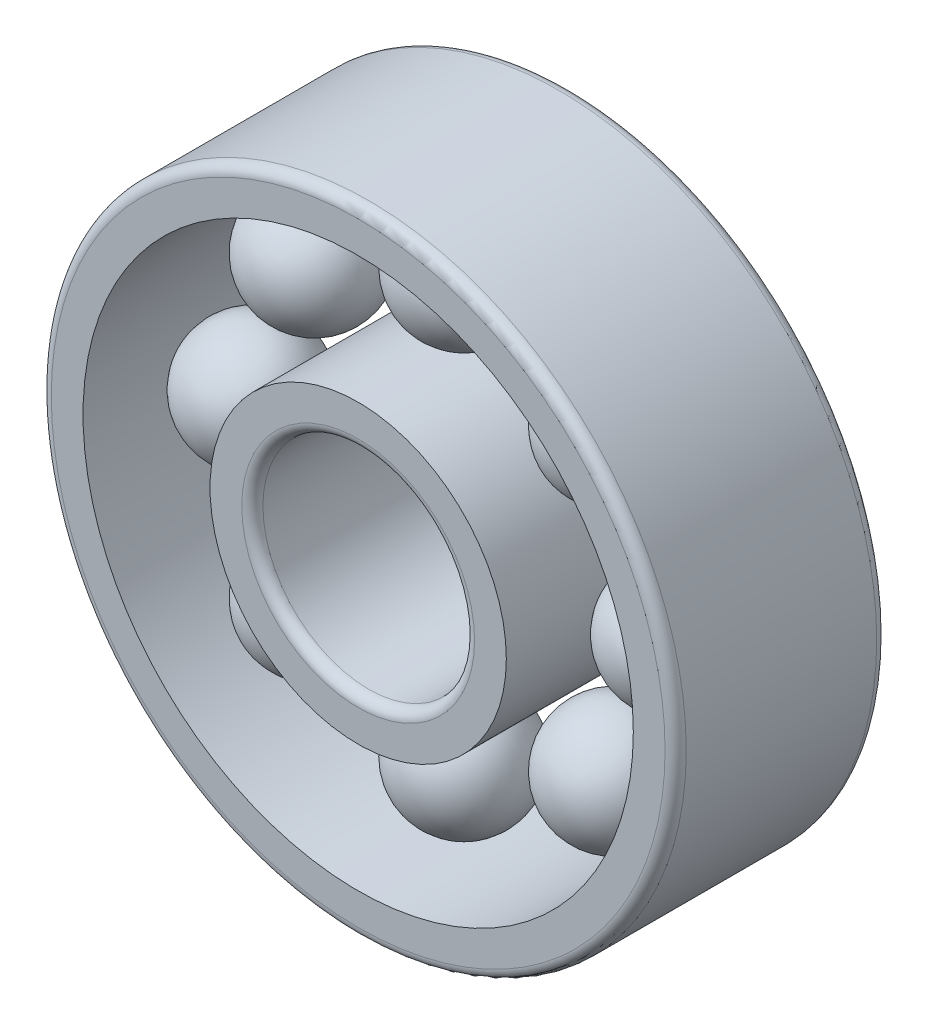
ISO-10303-21;
HEADER;
FILE_DESCRIPTION(('STEP AP214'),'2;1');
FILE_NAME('part.step','',(''),(''),'','','');
FILE_SCHEMA(('AUTOMOTIVE_DESIGN { 1 0 10303 214 1 1 1 1 }'));
ENDSEC;
DATA;
#1=APPLICATION_CONTEXT('core data for automotive mechanical design processes');
#2=APPLICATION_PROTOCOL_DEFINITION('international standard','automotive_design',2000,#1);
#3=PRODUCT_CONTEXT('',#1,'mechanical');
#4=PRODUCT('Part','Part','',(#3));
#5=PRODUCT_RELATED_PRODUCT_CATEGORY('part','',(#4));
#6=PRODUCT_DEFINITION_FORMATION('','',#4);
#7=PRODUCT_DEFINITION_CONTEXT('part definition',#1,'design');
#8=PRODUCT_DEFINITION('design','',#6,#7);
#9=PRODUCT_DEFINITION_SHAPE('','',#8);
#10=(LENGTH_UNIT() NAMED_UNIT(*) SI_UNIT(.MILLI.,.METRE.));
#11=(NAMED_UNIT(*) PLANE_ANGLE_UNIT() SI_UNIT($,.RADIAN.));
#12=(NAMED_UNIT(*) SI_UNIT($,.STERADIAN.) SOLID_ANGLE_UNIT());
#13=UNCERTAINTY_MEASURE_WITH_UNIT(LENGTH_MEASURE(1.E-05),#10,'distance_accuracy_value','');
#14=(GEOMETRIC_REPRESENTATION_CONTEXT(3) GLOBAL_UNCERTAINTY_ASSIGNED_CONTEXT((#13)) GLOBAL_UNIT_ASSIGNED_CONTEXT((#10,
#11,#12)) REPRESENTATION_CONTEXT('',''));
#15=CARTESIAN_POINT('',(0.,0.,0.));
#16=DIRECTION('',(0.,0.,1.));
#17=DIRECTION('',(1.,0.,0.));
#18=AXIS2_PLACEMENT_3D('',#15,#16,#17);
#19=CARTESIAN_POINT('',(0.707106781186547,-0.707106781186548,0.));
#20=DIRECTION('',(-0.707106781186547,0.707106781186548,0.));
#21=DIRECTION('',(0.,0.,-1.));
#22=AXIS2_PLACEMENT_3D('',#19,#20,#21);
#23=SPHERICAL_SURFACE('',#22,0.285);
#24=CARTESIAN_POINT('',(0.505581348548382,-0.505581348548382,0.));
#25=VERTEX_POINT('',#24);
#26=VERTEX_LOOP('',#25);
#27=FACE_BOUND('',#26,.T.);
#28=ADVANCED_FACE('F38',(#27),#23,.T.);
#29=CLOSED_SHELL('',(#28));
#30=MANIFOLD_SOLID_BREP('B2',#29);
#31=CARTESIAN_POINT('',(0.,-1.,0.));
#32=DIRECTION('',(0.,1.,0.));
#33=DIRECTION('',(0.,0.,-1.));
#34=AXIS2_PLACEMENT_3D('',#31,#32,#33);
#35=SPHERICAL_SURFACE('',#34,0.285);
#36=CARTESIAN_POINT('',(0.,-0.715,0.));
#37=VERTEX_POINT('',#36);
#38=VERTEX_LOOP('',#37);
#39=FACE_BOUND('',#38,.T.);
#40=ADVANCED_FACE('F57',(#39),#35,.T.);
#41=CLOSED_SHELL('',(#40));
#42=MANIFOLD_SOLID_BREP('B6',#41);
#43=CARTESIAN_POINT('',(-0.707106781186548,-0.707106781186547,0.));
#44=DIRECTION('',(0.707106781186548,0.707106781186547,0.));
#45=DIRECTION('',(0.,0.,-1.));
#46=AXIS2_PLACEMENT_3D('',#43,#44,#45);
#47=SPHERICAL_SURFACE('',#46,0.285);
#48=CARTESIAN_POINT('',(-0.505581348548382,-0.505581348548382,0.));
#49=VERTEX_POINT('',#48);
#50=VERTEX_LOOP('',#49);
#51=FACE_BOUND('',#50,.T.);
#52=ADVANCED_FACE('F76',(#51),#47,.T.);
#53=CLOSED_SHELL('',(#52));
#54=MANIFOLD_SOLID_BREP('B34',#53);
#55=CARTESIAN_POINT('',(-1.,0.,0.));
#56=DIRECTION('',(1.,0.,0.));
#57=DIRECTION('',(0.,0.,-1.));
#58=AXIS2_PLACEMENT_3D('',#55,#56,#57);
#59=SPHERICAL_SURFACE('',#58,0.285);
#60=CARTESIAN_POINT('',(-0.715,0.,0.));
#61=VERTEX_POINT('',#60);
#62=VERTEX_LOOP('',#61);
#63=FACE_BOUND('',#62,.T.);
#64=ADVANCED_FACE('F95',(#63),#59,.T.);
#65=CLOSED_SHELL('',(#64));
#66=MANIFOLD_SOLID_BREP('B53',#65);
#67=CARTESIAN_POINT('',(-0.707106781186547,0.707106781186548,0.));
#68=DIRECTION('',(0.707106781186547,-0.707106781186548,0.));
#69=DIRECTION('',(0.,0.,-1.));
#70=AXIS2_PLACEMENT_3D('',#67,#68,#69);
#71=SPHERICAL_SURFACE('',#70,0.285);
#72=CARTESIAN_POINT('',(-0.505581348548382,0.505581348548382,0.));
#73=VERTEX_POINT('',#72);
#74=VERTEX_LOOP('',#73);
#75=FACE_BOUND('',#74,.T.);
#76=ADVANCED_FACE('F114',(#75),#71,.T.);
#77=CLOSED_SHELL('',(#76));
#78=MANIFOLD_SOLID_BREP('B72',#77);
#79=CARTESIAN_POINT('',(0.,1.,0.));
#80=DIRECTION('',(0.,-1.,0.));
#81=DIRECTION('',(0.,0.,-1.));
#82=AXIS2_PLACEMENT_3D('',#79,#80,#81);
#83=SPHERICAL_SURFACE('',#82,0.285);
#84=CARTESIAN_POINT('',(0.,0.715,0.));
#85=VERTEX_POINT('',#84);
#86=VERTEX_LOOP('',#85);
#87=FACE_BOUND('',#86,.T.);
#88=ADVANCED_FACE('F133',(#87),#83,.T.);
#89=CLOSED_SHELL('',(#88));
#90=MANIFOLD_SOLID_BREP('B91',#89);
#91=CARTESIAN_POINT('',(0.707106781186548,0.707106781186548,0.));
#92=DIRECTION('',(-0.707106781186548,-0.707106781186548,0.));
#93=DIRECTION('',(0.,0.,-1.));
#94=AXIS2_PLACEMENT_3D('',#91,#92,#93);
#95=SPHERICAL_SURFACE('',#94,0.285);
#96=CARTESIAN_POINT('',(0.505581348548382,0.505581348548382,0.));
#97=VERTEX_POINT('',#96);
#98=VERTEX_LOOP('',#97);
#99=FACE_BOUND('',#98,.T.);
#100=ADVANCED_FACE('F152',(#99),#95,.T.);
#101=CLOSED_SHELL('',(#100));
#102=MANIFOLD_SOLID_BREP('B110',#101);
#103=CARTESIAN_POINT('',(1.,0.,0.));
#104=DIRECTION('',(-1.,0.,0.));
#105=DIRECTION('',(0.,0.,-1.));
#106=AXIS2_PLACEMENT_3D('',#103,#104,#105);
#107=SPHERICAL_SURFACE('',#106,0.285);
#108=CARTESIAN_POINT('',(0.715,0.,0.));
#109=VERTEX_POINT('',#108);
#110=VERTEX_LOOP('',#109);
#111=FACE_BOUND('',#110,.T.);
#112=ADVANCED_FACE('F173',(#111),#107,.T.);
#113=CLOSED_SHELL('',(#112));
#114=MANIFOLD_SOLID_BREP('B129',#113);
#115=CARTESIAN_POINT('',(0.,0.,1.75));
#116=DIRECTION('',(0.,0.,1.));
#117=DIRECTION('',(1.,0.,0.));
#118=AXIS2_PLACEMENT_3D('',#115,#116,#117);
#119=CYLINDRICAL_SURFACE('',#118,1.3);
#120=CARTESIAN_POINT('',(0.,0.,0.5));
#121=DIRECTION('',(0.,0.,1.));
#122=DIRECTION('',(1.,0.,0.));
#123=AXIS2_PLACEMENT_3D('',#120,#121,#122);
#124=CIRCLE('',#123,1.3);
#125=CARTESIAN_POINT('',(1.3,0.,0.5));
#126=VERTEX_POINT('',#125);
#127=EDGE_CURVE('E213',#126,#126,#124,.T.);
#128=ORIENTED_EDGE('',*,*,#127,.T.);
#129=EDGE_LOOP('',(#128));
#130=FACE_BOUND('',#129,.T.);
#131=CARTESIAN_POINT('',(0.,0.,-0.5));
#132=DIRECTION('',(0.,0.,1.));
#133=DIRECTION('',(1.,0.,0.));
#134=AXIS2_PLACEMENT_3D('',#131,#132,#133);
#135=CIRCLE('',#134,1.3);
#136=CARTESIAN_POINT('',(1.3,0.,-0.5));
#137=VERTEX_POINT('',#136);
#138=EDGE_CURVE('E216',#137,#137,#135,.T.);
#139=ORIENTED_EDGE('',*,*,#138,.F.);
#140=EDGE_LOOP('',(#139));
#141=FACE_BOUND('',#140,.T.);
#142=ADVANCED_FACE('F193',(#130,#141),#119,.F.);
#143=CARTESIAN_POINT('',(1.3,0.,0.5));
#144=DIRECTION('',(0.,0.,1.));
#145=DIRECTION('',(1.,0.,0.));
#146=AXIS2_PLACEMENT_3D('',#143,#144,#145);
#147=PLANE('',#146);
#148=CARTESIAN_POINT('',(0.,0.,0.5));
#149=DIRECTION('',(0.,0.,1.));
#150=DIRECTION('',(1.,0.,0.));
#151=AXIS2_PLACEMENT_3D('',#148,#149,#150);
#152=CIRCLE('',#151,1.45);
#153=CARTESIAN_POINT('',(1.45,0.,0.5));
#154=VERTEX_POINT('',#153);
#155=EDGE_CURVE('E172',#154,#154,#152,.T.);
#156=ORIENTED_EDGE('',*,*,#155,.T.);
#157=EDGE_LOOP('',(#156));
#158=FACE_BOUND('',#157,.T.);
#159=ORIENTED_EDGE('',*,*,#127,.F.);
#160=EDGE_LOOP('',(#159));
#161=FACE_BOUND('',#160,.T.);
#162=ADVANCED_FACE('F223',(#158,#161),#147,.T.);
#163=CARTESIAN_POINT('',(0.,0.,1.75));
#164=DIRECTION('',(0.,0.,1.));
#165=DIRECTION('',(1.,0.,0.));
#166=AXIS2_PLACEMENT_3D('',#163,#164,#165);
#167=CYLINDRICAL_SURFACE('',#166,1.5);
#168=CARTESIAN_POINT('',(0.,0.,-0.45));
#169=DIRECTION('',(0.,0.,-1.));
#170=DIRECTION('',(-1.,0.,0.));
#171=AXIS2_PLACEMENT_3D('',#168,#169,#170);
#172=CIRCLE('',#171,1.5);
#173=CARTESIAN_POINT('',(-1.5,0.,-0.45));
#174=VERTEX_POINT('',#173);
#175=EDGE_CURVE('E204',#174,#174,#172,.F.);
#176=ORIENTED_EDGE('',*,*,#175,.T.);
#177=EDGE_LOOP('',(#176));
#178=FACE_BOUND('',#177,.T.);
#179=CARTESIAN_POINT('',(0.,0.,0.45));
#180=DIRECTION('',(0.,0.,1.));
#181=DIRECTION('',(1.,0.,0.));
#182=AXIS2_PLACEMENT_3D('',#179,#180,#181);
#183=CIRCLE('',#182,1.5);
#184=CARTESIAN_POINT('',(1.5,0.,0.45));
#185=VERTEX_POINT('',#184);
#186=EDGE_CURVE('E208',#185,#185,#183,.F.);
#187=ORIENTED_EDGE('',*,*,#186,.T.);
#188=EDGE_LOOP('',(#187));
#189=FACE_BOUND('',#188,.T.);
#190=ADVANCED_FACE('F229',(#178,#189),#167,.T.);
#191=CARTESIAN_POINT('',(1.5,0.,-0.5));
#192=DIRECTION('',(0.,0.,-1.));
#193=DIRECTION('',(-1.,0.,0.));
#194=AXIS2_PLACEMENT_3D('',#191,#192,#193);
#195=PLANE('',#194);
#196=CARTESIAN_POINT('',(0.,0.,-0.5));
#197=DIRECTION('',(0.,0.,-1.));
#198=DIRECTION('',(-1.,0.,0.));
#199=AXIS2_PLACEMENT_3D('',#196,#197,#198);
#200=CIRCLE('',#199,1.45);
#201=CARTESIAN_POINT('',(-1.45,0.,-0.5));
#202=VERTEX_POINT('',#201);
#203=EDGE_CURVE('E200',#202,#202,#200,.T.);
#204=ORIENTED_EDGE('',*,*,#203,.T.);
#205=EDGE_LOOP('',(#204));
#206=FACE_BOUND('',#205,.T.);
#207=ORIENTED_EDGE('',*,*,#138,.T.);
#208=EDGE_LOOP('',(#207));
#209=FACE_BOUND('',#208,.T.);
#210=ADVANCED_FACE('F220',(#206,#209),#195,.T.);
#211=CARTESIAN_POINT('',(0.,0.,-0.45));
#212=DIRECTION('',(0.,0.,-1.));
#213=DIRECTION('',(-1.,0.,0.));
#214=AXIS2_PLACEMENT_3D('',#211,#212,#213);
#215=TOROIDAL_SURFACE('',#214,1.45,0.05);
#216=ORIENTED_EDGE('',*,*,#203,.F.);
#217=EDGE_LOOP('',(#216));
#218=FACE_BOUND('',#217,.T.);
#219=ORIENTED_EDGE('',*,*,#175,.F.);
#220=EDGE_LOOP('',(#219));
#221=FACE_BOUND('',#220,.T.);
#222=ADVANCED_FACE('F232',(#218,#221),#215,.T.);
#223=CARTESIAN_POINT('',(0.,0.,0.45));
#224=DIRECTION('',(0.,0.,1.));
#225=DIRECTION('',(1.,0.,0.));
#226=AXIS2_PLACEMENT_3D('',#223,#224,#225);
#227=TOROIDAL_SURFACE('',#226,1.45,0.05);
#228=ORIENTED_EDGE('',*,*,#186,.F.);
#229=EDGE_LOOP('',(#228));
#230=FACE_BOUND('',#229,.T.);
#231=ORIENTED_EDGE('',*,*,#155,.F.);
#232=EDGE_LOOP('',(#231));
#233=FACE_BOUND('',#232,.T.);
#234=ADVANCED_FACE('F195',(#230,#233),#227,.T.);
#235=CLOSED_SHELL('',(#142,#162,#190,#210,#222,#234));
#236=MANIFOLD_SOLID_BREP('B148',#235);
#237=CARTESIAN_POINT('',(0.,0.,1.75));
#238=DIRECTION('',(0.,0.,1.));
#239=DIRECTION('',(1.,0.,0.));
#240=AXIS2_PLACEMENT_3D('',#237,#238,#239);
#241=CYLINDRICAL_SURFACE('',#240,0.5);
#242=CARTESIAN_POINT('',(0.,0.,-0.45));
#243=DIRECTION('',(0.,0.,-1.));
#244=DIRECTION('',(-1.,0.,0.));
#245=AXIS2_PLACEMENT_3D('',#242,#243,#244);
#246=CIRCLE('',#245,0.5);
#247=CARTESIAN_POINT('',(-0.5,0.,-0.45));
#248=VERTEX_POINT('',#247);
#249=EDGE_CURVE('E292',#248,#248,#246,.T.);
#250=ORIENTED_EDGE('',*,*,#249,.T.);
#251=EDGE_LOOP('',(#250));
#252=FACE_BOUND('',#251,.T.);
#253=CARTESIAN_POINT('',(0.,0.,0.45));
#254=DIRECTION('',(0.,0.,1.));
#255=DIRECTION('',(1.,0.,0.));
#256=AXIS2_PLACEMENT_3D('',#253,#254,#255);
#257=CIRCLE('',#256,0.5);
#258=CARTESIAN_POINT('',(0.5,0.,0.45));
#259=VERTEX_POINT('',#258);
#260=EDGE_CURVE('E296',#259,#259,#257,.T.);
#261=ORIENTED_EDGE('',*,*,#260,.T.);
#262=EDGE_LOOP('',(#261));
#263=FACE_BOUND('',#262,.T.);
#264=ADVANCED_FACE('F285',(#252,#263),#241,.F.);
#265=CARTESIAN_POINT('',(0.5,0.,0.5));
#266=DIRECTION('',(0.,0.,1.));
#267=DIRECTION('',(1.,0.,0.));
#268=AXIS2_PLACEMENT_3D('',#265,#266,#267);
#269=PLANE('',#268);
#270=CARTESIAN_POINT('',(0.,0.,0.5));
#271=DIRECTION('',(0.,0.,1.));
#272=DIRECTION('',(1.,0.,0.));
#273=AXIS2_PLACEMENT_3D('',#270,#271,#272);
#274=CIRCLE('',#273,0.55);
#275=CARTESIAN_POINT('',(0.55,0.,0.5));
#276=VERTEX_POINT('',#275);
#277=EDGE_CURVE('E192',#276,#276,#274,.F.);
#278=ORIENTED_EDGE('',*,*,#277,.T.);
#279=EDGE_LOOP('',(#278));
#280=FACE_BOUND('',#279,.T.);
#281=CARTESIAN_POINT('',(0.,0.,0.5));
#282=DIRECTION('',(0.,0.,1.));
#283=DIRECTION('',(1.,0.,0.));
#284=AXIS2_PLACEMENT_3D('',#281,#282,#283);
#285=CIRCLE('',#284,0.7);
#286=CARTESIAN_POINT('',(0.7,0.,0.5));
#287=VERTEX_POINT('',#286);
#288=EDGE_CURVE('E305',#287,#287,#285,.T.);
#289=ORIENTED_EDGE('',*,*,#288,.T.);
#290=EDGE_LOOP('',(#289));
#291=FACE_BOUND('',#290,.T.);
#292=ADVANCED_FACE('F325',(#280,#291),#269,.T.);
#293=CARTESIAN_POINT('',(0.,0.,1.75));
#294=DIRECTION('',(0.,0.,1.));
#295=DIRECTION('',(1.,0.,0.));
#296=AXIS2_PLACEMENT_3D('',#293,#294,#295);
#297=CYLINDRICAL_SURFACE('',#296,0.7);
#298=CARTESIAN_POINT('',(0.,0.,-0.5));
#299=DIRECTION('',(0.,0.,1.));
#300=DIRECTION('',(1.,0.,0.));
#301=AXIS2_PLACEMENT_3D('',#298,#299,#300);
#302=CIRCLE('',#301,0.7);
#303=CARTESIAN_POINT('',(0.7,0.,-0.5));
#304=VERTEX_POINT('',#303);
#305=EDGE_CURVE('E308',#304,#304,#302,.T.);
#306=ORIENTED_EDGE('',*,*,#305,.T.);
#307=EDGE_LOOP('',(#306));
#308=FACE_BOUND('',#307,.T.);
#309=ORIENTED_EDGE('',*,*,#288,.F.);
#310=EDGE_LOOP('',(#309));
#311=FACE_BOUND('',#310,.T.);
#312=ADVANCED_FACE('F312',(#308,#311),#297,.T.);
#313=CARTESIAN_POINT('',(0.7,0.,-0.5));
#314=DIRECTION('',(0.,0.,-1.));
#315=DIRECTION('',(-1.,0.,0.));
#316=AXIS2_PLACEMENT_3D('',#313,#314,#315);
#317=PLANE('',#316);
#318=CARTESIAN_POINT('',(0.,0.,-0.5));
#319=DIRECTION('',(0.,0.,-1.));
#320=DIRECTION('',(-1.,0.,0.));
#321=AXIS2_PLACEMENT_3D('',#318,#319,#320);
#322=CIRCLE('',#321,0.55);
#323=CARTESIAN_POINT('',(-0.55,0.,-0.5));
#324=VERTEX_POINT('',#323);
#325=EDGE_CURVE('E300',#324,#324,#322,.F.);
#326=ORIENTED_EDGE('',*,*,#325,.T.);
#327=EDGE_LOOP('',(#326));
#328=FACE_BOUND('',#327,.T.);
#329=ORIENTED_EDGE('',*,*,#305,.F.);
#330=EDGE_LOOP('',(#329));
#331=FACE_BOUND('',#330,.T.);
#332=ADVANCED_FACE('F315',(#328,#331),#317,.T.);
#333=CARTESIAN_POINT('',(0.,0.,-0.45));
#334=DIRECTION('',(0.,0.,-1.));
#335=DIRECTION('',(-1.,0.,0.));
#336=AXIS2_PLACEMENT_3D('',#333,#334,#335);
#337=TOROIDAL_SURFACE('',#336,0.55,0.05);
#338=ORIENTED_EDGE('',*,*,#249,.F.);
#339=EDGE_LOOP('',(#338));
#340=FACE_BOUND('',#339,.T.);
#341=ORIENTED_EDGE('',*,*,#325,.F.);
#342=EDGE_LOOP('',(#341));
#343=FACE_BOUND('',#342,.T.);
#344=ADVANCED_FACE('F317',(#340,#343),#337,.T.);
#345=CARTESIAN_POINT('',(0.,0.,0.45));
#346=DIRECTION('',(0.,0.,1.));
#347=DIRECTION('',(1.,0.,0.));
#348=AXIS2_PLACEMENT_3D('',#345,#346,#347);
#349=TOROIDAL_SURFACE('',#348,0.55,0.05);
#350=ORIENTED_EDGE('',*,*,#277,.F.);
#351=EDGE_LOOP('',(#350));
#352=FACE_BOUND('',#351,.T.);
#353=ORIENTED_EDGE('',*,*,#260,.F.);
#354=EDGE_LOOP('',(#353));
#355=FACE_BOUND('',#354,.T.);
#356=ADVANCED_FACE('F287',(#352,#355),#349,.T.);
#357=CLOSED_SHELL('',(#264,#292,#312,#332,#344,#356));
#358=MANIFOLD_SOLID_BREP('B167',#357);
#359=ADVANCED_BREP_SHAPE_REPRESENTATION('',(#18,#30,#42,#54,#66,#78,#90,#102,#114,#236,#358),#14);
#360=SHAPE_DEFINITION_REPRESENTATION(#9,#359);
ENDSEC;
END-ISO-10303-21;
